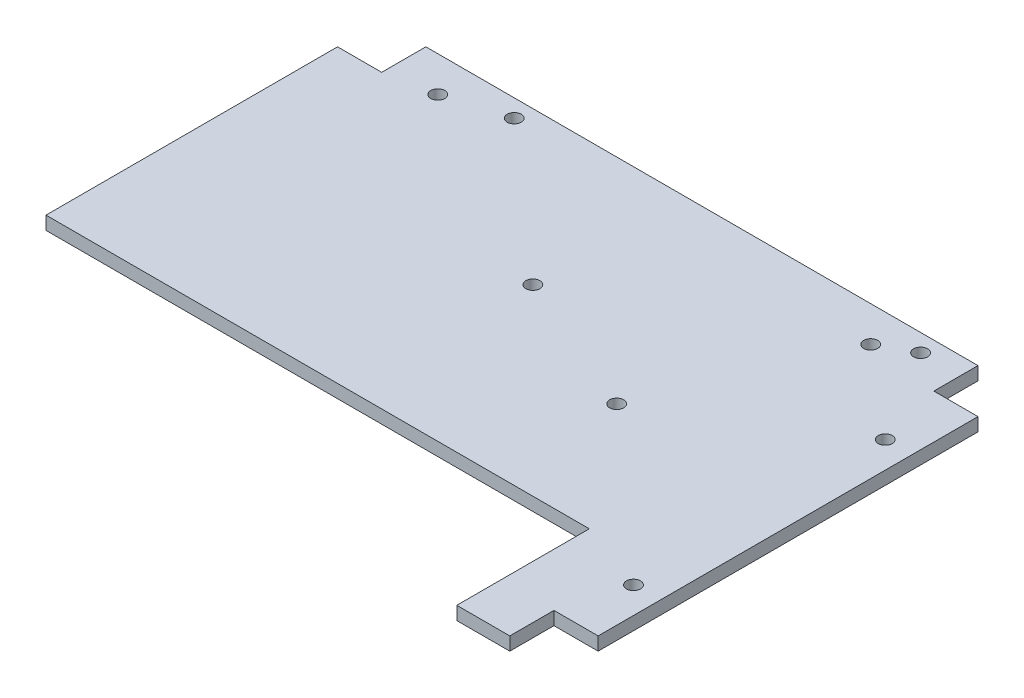
ISO-10303-21;
HEADER;
FILE_DESCRIPTION(('STEP AP214'),'2;1');
FILE_NAME('part.step','',(''),(''),'','','');
FILE_SCHEMA(('AUTOMOTIVE_DESIGN { 1 0 10303 214 1 1 1 1 }'));
ENDSEC;
DATA;
#1=APPLICATION_CONTEXT('core data for automotive mechanical design processes');
#2=APPLICATION_PROTOCOL_DEFINITION('international standard','automotive_design',2000,#1);
#3=PRODUCT_CONTEXT('',#1,'mechanical');
#4=PRODUCT('Part','Part','',(#3));
#5=PRODUCT_RELATED_PRODUCT_CATEGORY('part','',(#4));
#6=PRODUCT_DEFINITION_FORMATION('','',#4);
#7=PRODUCT_DEFINITION_CONTEXT('part definition',#1,'design');
#8=PRODUCT_DEFINITION('design','',#6,#7);
#9=PRODUCT_DEFINITION_SHAPE('','',#8);
#10=(LENGTH_UNIT() NAMED_UNIT(*) SI_UNIT(.MILLI.,.METRE.));
#11=(NAMED_UNIT(*) PLANE_ANGLE_UNIT() SI_UNIT($,.RADIAN.));
#12=(NAMED_UNIT(*) SI_UNIT($,.STERADIAN.) SOLID_ANGLE_UNIT());
#13=UNCERTAINTY_MEASURE_WITH_UNIT(LENGTH_MEASURE(1.E-05),#10,'distance_accuracy_value','');
#14=(GEOMETRIC_REPRESENTATION_CONTEXT(3) GLOBAL_UNCERTAINTY_ASSIGNED_CONTEXT((#13)) GLOBAL_UNIT_ASSIGNED_CONTEXT((#10,
#11,#12)) REPRESENTATION_CONTEXT('',''));
#15=CARTESIAN_POINT('',(0.,0.,0.));
#16=DIRECTION('',(0.,0.,1.));
#17=DIRECTION('',(1.,0.,0.));
#18=AXIS2_PLACEMENT_3D('',#15,#16,#17);
#19=CARTESIAN_POINT('',(0.,3.,96.));
#20=DIRECTION('',(-1.,0.,0.));
#21=DIRECTION('',(0.,0.,1.));
#22=AXIS2_PLACEMENT_3D('',#19,#20,#21);
#23=PLANE('',#22);
#24=DIRECTION('',(0.,0.,-1.));
#25=VECTOR('',#24,1.);
#26=CARTESIAN_POINT('',(0.,0.,96.));
#27=LINE('',#26,#25);
#28=CARTESIAN_POINT('',(0.,0.,96.));
#29=VERTEX_POINT('',#28);
#30=CARTESIAN_POINT('',(0.,0.,10.));
#31=VERTEX_POINT('',#30);
#32=EDGE_CURVE('E151',#29,#31,#27,.T.);
#33=ORIENTED_EDGE('',*,*,#32,.T.);
#34=DIRECTION('',(0.,-1.,0.));
#35=VECTOR('',#34,1.);
#36=CARTESIAN_POINT('',(0.,3.,10.));
#37=LINE('',#36,#35);
#38=CARTESIAN_POINT('',(0.,3.,10.));
#39=VERTEX_POINT('',#38);
#40=EDGE_CURVE('E11',#39,#31,#37,.T.);
#41=ORIENTED_EDGE('',*,*,#40,.F.);
#42=DIRECTION('',(0.,0.,-1.));
#43=VECTOR('',#42,1.);
#44=CARTESIAN_POINT('',(0.,3.,96.));
#45=LINE('',#44,#43);
#46=CARTESIAN_POINT('',(0.,3.,96.));
#47=VERTEX_POINT('',#46);
#48=EDGE_CURVE('E174',#47,#39,#45,.T.);
#49=ORIENTED_EDGE('',*,*,#48,.F.);
#50=DIRECTION('',(0.,-1.,0.));
#51=VECTOR('',#50,1.);
#52=CARTESIAN_POINT('',(0.,3.,96.));
#53=LINE('',#52,#51);
#54=EDGE_CURVE('E147',#47,#29,#53,.T.);
#55=ORIENTED_EDGE('',*,*,#54,.T.);
#56=EDGE_LOOP('',(#33,#41,#49,#55));
#57=FACE_BOUND('',#56,.T.);
#58=ADVANCED_FACE('F31',(#57),#23,.F.);
#59=CARTESIAN_POINT('',(-10.,3.,10.));
#60=DIRECTION('',(0.,0.,1.));
#61=DIRECTION('',(1.,0.,0.));
#62=AXIS2_PLACEMENT_3D('',#59,#60,#61);
#63=PLANE('',#62);
#64=DIRECTION('',(-1.,0.,0.));
#65=VECTOR('',#64,1.);
#66=CARTESIAN_POINT('',(-10.,0.,10.));
#67=LINE('',#66,#65);
#68=CARTESIAN_POINT('',(-10.,0.,10.));
#69=VERTEX_POINT('',#68);
#70=EDGE_CURVE('E154',#31,#69,#67,.T.);
#71=ORIENTED_EDGE('',*,*,#70,.T.);
#72=DIRECTION('',(0.,-1.,0.));
#73=VECTOR('',#72,1.);
#74=CARTESIAN_POINT('',(-10.,3.,10.));
#75=LINE('',#74,#73);
#76=CARTESIAN_POINT('',(-10.,3.,10.));
#77=VERTEX_POINT('',#76);
#78=EDGE_CURVE('E39',#77,#69,#75,.T.);
#79=ORIENTED_EDGE('',*,*,#78,.F.);
#80=DIRECTION('',(-1.,0.,0.));
#81=VECTOR('',#80,1.);
#82=CARTESIAN_POINT('',(-10.,3.,10.));
#83=LINE('',#82,#81);
#84=EDGE_CURVE('E102',#39,#77,#83,.T.);
#85=ORIENTED_EDGE('',*,*,#84,.F.);
#86=ORIENTED_EDGE('',*,*,#40,.T.);
#87=EDGE_LOOP('',(#71,#79,#85,#86));
#88=FACE_BOUND('',#87,.T.);
#89=ADVANCED_FACE('F253',(#88),#63,.F.);
#90=CARTESIAN_POINT('',(-10.,3.,0.));
#91=DIRECTION('',(-1.,0.,0.));
#92=DIRECTION('',(0.,0.,1.));
#93=AXIS2_PLACEMENT_3D('',#90,#91,#92);
#94=PLANE('',#93);
#95=DIRECTION('',(0.,0.,-1.));
#96=VECTOR('',#95,1.);
#97=CARTESIAN_POINT('',(-10.,0.,0.));
#98=LINE('',#97,#96);
#99=CARTESIAN_POINT('',(-10.,0.,0.));
#100=VERTEX_POINT('',#99);
#101=EDGE_CURVE('E157',#69,#100,#98,.T.);
#102=ORIENTED_EDGE('',*,*,#101,.T.);
#103=DIRECTION('',(0.,-1.,0.));
#104=VECTOR('',#103,1.);
#105=CARTESIAN_POINT('',(-10.,3.,0.));
#106=LINE('',#105,#104);
#107=CARTESIAN_POINT('',(-10.,3.,0.));
#108=VERTEX_POINT('',#107);
#109=EDGE_CURVE('E193',#108,#100,#106,.T.);
#110=ORIENTED_EDGE('',*,*,#109,.F.);
#111=DIRECTION('',(0.,0.,-1.));
#112=VECTOR('',#111,1.);
#113=CARTESIAN_POINT('',(-10.,3.,0.));
#114=LINE('',#113,#112);
#115=EDGE_CURVE('E201',#77,#108,#114,.T.);
#116=ORIENTED_EDGE('',*,*,#115,.F.);
#117=ORIENTED_EDGE('',*,*,#78,.T.);
#118=EDGE_LOOP('',(#102,#110,#116,#117));
#119=FACE_BOUND('',#118,.T.);
#120=ADVANCED_FACE('F199',(#119),#94,.F.);
#121=CARTESIAN_POINT('',(-135.,3.,0.));
#122=DIRECTION('',(0.,0.,1.));
#123=DIRECTION('',(1.,0.,0.));
#124=AXIS2_PLACEMENT_3D('',#121,#122,#123);
#125=PLANE('',#124);
#126=DIRECTION('',(-1.,0.,0.));
#127=VECTOR('',#126,1.);
#128=CARTESIAN_POINT('',(-135.,0.,0.));
#129=LINE('',#128,#127);
#130=CARTESIAN_POINT('',(-135.,0.,0.));
#131=VERTEX_POINT('',#130);
#132=EDGE_CURVE('E159',#100,#131,#129,.T.);
#133=ORIENTED_EDGE('',*,*,#132,.T.);
#134=DIRECTION('',(0.,-1.,0.));
#135=VECTOR('',#134,1.);
#136=CARTESIAN_POINT('',(-135.,3.,0.));
#137=LINE('',#136,#135);
#138=CARTESIAN_POINT('',(-135.,3.,0.));
#139=VERTEX_POINT('',#138);
#140=EDGE_CURVE('E190',#139,#131,#137,.T.);
#141=ORIENTED_EDGE('',*,*,#140,.F.);
#142=DIRECTION('',(-1.,0.,0.));
#143=VECTOR('',#142,1.);
#144=CARTESIAN_POINT('',(-135.,3.,0.));
#145=LINE('',#144,#143);
#146=EDGE_CURVE('E219',#108,#139,#145,.T.);
#147=ORIENTED_EDGE('',*,*,#146,.F.);
#148=ORIENTED_EDGE('',*,*,#109,.T.);
#149=EDGE_LOOP('',(#133,#141,#147,#148));
#150=FACE_BOUND('',#149,.T.);
#151=ADVANCED_FACE('F210',(#150),#125,.F.);
#152=CARTESIAN_POINT('',(-135.,3.,0.));
#153=DIRECTION('',(1.,0.,0.));
#154=DIRECTION('',(0.,0.,-1.));
#155=AXIS2_PLACEMENT_3D('',#152,#153,#154);
#156=PLANE('',#155);
#157=DIRECTION('',(0.,0.,1.));
#158=VECTOR('',#157,1.);
#159=CARTESIAN_POINT('',(-135.,0.,0.));
#160=LINE('',#159,#158);
#161=CARTESIAN_POINT('',(-135.,0.,10.));
#162=VERTEX_POINT('',#161);
#163=EDGE_CURVE('E161',#131,#162,#160,.T.);
#164=ORIENTED_EDGE('',*,*,#163,.T.);
#165=DIRECTION('',(0.,-1.,0.));
#166=VECTOR('',#165,1.);
#167=CARTESIAN_POINT('',(-135.,3.,10.));
#168=LINE('',#167,#166);
#169=CARTESIAN_POINT('',(-135.,3.,10.));
#170=VERTEX_POINT('',#169);
#171=EDGE_CURVE('E187',#170,#162,#168,.T.);
#172=ORIENTED_EDGE('',*,*,#171,.F.);
#173=DIRECTION('',(0.,0.,1.));
#174=VECTOR('',#173,1.);
#175=CARTESIAN_POINT('',(-135.,3.,0.));
#176=LINE('',#175,#174);
#177=EDGE_CURVE('E216',#139,#170,#176,.T.);
#178=ORIENTED_EDGE('',*,*,#177,.F.);
#179=ORIENTED_EDGE('',*,*,#140,.T.);
#180=EDGE_LOOP('',(#164,#172,#178,#179));
#181=FACE_BOUND('',#180,.T.);
#182=ADVANCED_FACE('F214',(#181),#156,.F.);
#183=CARTESIAN_POINT('',(-135.,3.,10.));
#184=DIRECTION('',(0.,0.,1.));
#185=DIRECTION('',(1.,0.,0.));
#186=AXIS2_PLACEMENT_3D('',#183,#184,#185);
#187=PLANE('',#186);
#188=DIRECTION('',(-1.,0.,0.));
#189=VECTOR('',#188,1.);
#190=CARTESIAN_POINT('',(-135.,0.,10.));
#191=LINE('',#190,#189);
#192=CARTESIAN_POINT('',(-145.,0.,10.));
#193=VERTEX_POINT('',#192);
#194=EDGE_CURVE('E163',#162,#193,#191,.T.);
#195=ORIENTED_EDGE('',*,*,#194,.T.);
#196=DIRECTION('',(0.,-1.,0.));
#197=VECTOR('',#196,1.);
#198=CARTESIAN_POINT('',(-145.,3.,10.));
#199=LINE('',#198,#197);
#200=CARTESIAN_POINT('',(-145.,3.,10.));
#201=VERTEX_POINT('',#200);
#202=EDGE_CURVE('E184',#201,#193,#199,.T.);
#203=ORIENTED_EDGE('',*,*,#202,.F.);
#204=DIRECTION('',(-1.,0.,0.));
#205=VECTOR('',#204,1.);
#206=CARTESIAN_POINT('',(-135.,3.,10.));
#207=LINE('',#206,#205);
#208=EDGE_CURVE('E218',#170,#201,#207,.T.);
#209=ORIENTED_EDGE('',*,*,#208,.F.);
#210=ORIENTED_EDGE('',*,*,#171,.T.);
#211=EDGE_LOOP('',(#195,#203,#209,#210));
#212=FACE_BOUND('',#211,.T.);
#213=ADVANCED_FACE('F266',(#212),#187,.F.);
#214=CARTESIAN_POINT('',(-145.,3.,10.));
#215=DIRECTION('',(1.,0.,0.));
#216=DIRECTION('',(0.,0.,-1.));
#217=AXIS2_PLACEMENT_3D('',#214,#215,#216);
#218=PLANE('',#217);
#219=DIRECTION('',(0.,0.,1.));
#220=VECTOR('',#219,1.);
#221=CARTESIAN_POINT('',(-145.,0.,10.));
#222=LINE('',#221,#220);
#223=CARTESIAN_POINT('',(-145.,0.,76.));
#224=VERTEX_POINT('',#223);
#225=EDGE_CURVE('E165',#193,#224,#222,.T.);
#226=ORIENTED_EDGE('',*,*,#225,.T.);
#227=DIRECTION('',(0.,-1.,0.));
#228=VECTOR('',#227,1.);
#229=CARTESIAN_POINT('',(-145.,3.,76.));
#230=LINE('',#229,#228);
#231=CARTESIAN_POINT('',(-145.,3.,76.));
#232=VERTEX_POINT('',#231);
#233=EDGE_CURVE('E181',#232,#224,#230,.T.);
#234=ORIENTED_EDGE('',*,*,#233,.F.);
#235=DIRECTION('',(0.,0.,1.));
#236=VECTOR('',#235,1.);
#237=CARTESIAN_POINT('',(-145.,3.,10.));
#238=LINE('',#237,#236);
#239=EDGE_CURVE('E221',#201,#232,#238,.T.);
#240=ORIENTED_EDGE('',*,*,#239,.F.);
#241=ORIENTED_EDGE('',*,*,#202,.T.);
#242=EDGE_LOOP('',(#226,#234,#240,#241));
#243=FACE_BOUND('',#242,.T.);
#244=ADVANCED_FACE('F269',(#243),#218,.F.);
#245=CARTESIAN_POINT('',(-145.,3.,76.));
#246=DIRECTION('',(0.,0.,-1.));
#247=DIRECTION('',(-1.,0.,0.));
#248=AXIS2_PLACEMENT_3D('',#245,#246,#247);
#249=PLANE('',#248);
#250=DIRECTION('',(1.,0.,0.));
#251=VECTOR('',#250,1.);
#252=CARTESIAN_POINT('',(-145.,0.,76.));
#253=LINE('',#252,#251);
#254=CARTESIAN_POINT('',(-22.,0.,76.));
#255=VERTEX_POINT('',#254);
#256=EDGE_CURVE('E167',#224,#255,#253,.T.);
#257=ORIENTED_EDGE('',*,*,#256,.T.);
#258=DIRECTION('',(0.,-1.,0.));
#259=VECTOR('',#258,1.);
#260=CARTESIAN_POINT('',(-22.,3.,76.));
#261=LINE('',#260,#259);
#262=CARTESIAN_POINT('',(-22.,3.,76.));
#263=VERTEX_POINT('',#262);
#264=EDGE_CURVE('E178',#263,#255,#261,.T.);
#265=ORIENTED_EDGE('',*,*,#264,.F.);
#266=DIRECTION('',(1.,0.,0.));
#267=VECTOR('',#266,1.);
#268=CARTESIAN_POINT('',(-145.,3.,76.));
#269=LINE('',#268,#267);
#270=EDGE_CURVE('E227',#232,#263,#269,.T.);
#271=ORIENTED_EDGE('',*,*,#270,.F.);
#272=ORIENTED_EDGE('',*,*,#233,.T.);
#273=EDGE_LOOP('',(#257,#265,#271,#272));
#274=FACE_BOUND('',#273,.T.);
#275=ADVANCED_FACE('F233',(#274),#249,.F.);
#276=CARTESIAN_POINT('',(-22.,3.,76.));
#277=DIRECTION('',(1.,0.,0.));
#278=DIRECTION('',(0.,0.,-1.));
#279=AXIS2_PLACEMENT_3D('',#276,#277,#278);
#280=PLANE('',#279);
#281=DIRECTION('',(0.,0.,1.));
#282=VECTOR('',#281,1.);
#283=CARTESIAN_POINT('',(-22.,0.,76.));
#284=LINE('',#283,#282);
#285=CARTESIAN_POINT('',(-22.,0.,106.));
#286=VERTEX_POINT('',#285);
#287=EDGE_CURVE('E169',#255,#286,#284,.T.);
#288=ORIENTED_EDGE('',*,*,#287,.T.);
#289=DIRECTION('',(0.,-1.,0.));
#290=VECTOR('',#289,1.);
#291=CARTESIAN_POINT('',(-22.,3.,106.));
#292=LINE('',#291,#290);
#293=CARTESIAN_POINT('',(-22.,3.,106.));
#294=VERTEX_POINT('',#293);
#295=EDGE_CURVE('E142',#294,#286,#292,.T.);
#296=ORIENTED_EDGE('',*,*,#295,.F.);
#297=DIRECTION('',(0.,0.,1.));
#298=VECTOR('',#297,1.);
#299=CARTESIAN_POINT('',(-22.,3.,76.));
#300=LINE('',#299,#298);
#301=EDGE_CURVE('E133',#263,#294,#300,.T.);
#302=ORIENTED_EDGE('',*,*,#301,.F.);
#303=ORIENTED_EDGE('',*,*,#264,.T.);
#304=EDGE_LOOP('',(#288,#296,#302,#303));
#305=FACE_BOUND('',#304,.T.);
#306=ADVANCED_FACE('F237',(#305),#280,.F.);
#307=CARTESIAN_POINT('',(-22.,3.,106.));
#308=DIRECTION('',(0.,0.,-1.));
#309=DIRECTION('',(-1.,0.,0.));
#310=AXIS2_PLACEMENT_3D('',#307,#308,#309);
#311=PLANE('',#310);
#312=DIRECTION('',(1.,0.,0.));
#313=VECTOR('',#312,1.);
#314=CARTESIAN_POINT('',(-22.,0.,106.));
#315=LINE('',#314,#313);
#316=CARTESIAN_POINT('',(-10.,0.,106.));
#317=VERTEX_POINT('',#316);
#318=EDGE_CURVE('E141',#286,#317,#315,.T.);
#319=ORIENTED_EDGE('',*,*,#318,.T.);
#320=DIRECTION('',(0.,-1.,0.));
#321=VECTOR('',#320,1.);
#322=CARTESIAN_POINT('',(-10.,3.,106.));
#323=LINE('',#322,#321);
#324=CARTESIAN_POINT('',(-10.,3.,106.));
#325=VERTEX_POINT('',#324);
#326=EDGE_CURVE('E138',#325,#317,#323,.T.);
#327=ORIENTED_EDGE('',*,*,#326,.F.);
#328=DIRECTION('',(1.,0.,0.));
#329=VECTOR('',#328,1.);
#330=CARTESIAN_POINT('',(-22.,3.,106.));
#331=LINE('',#330,#329);
#332=EDGE_CURVE('E127',#294,#325,#331,.T.);
#333=ORIENTED_EDGE('',*,*,#332,.F.);
#334=ORIENTED_EDGE('',*,*,#295,.T.);
#335=EDGE_LOOP('',(#319,#327,#333,#334));
#336=FACE_BOUND('',#335,.T.);
#337=ADVANCED_FACE('F139',(#336),#311,.F.);
#338=CARTESIAN_POINT('',(-10.,3.,106.));
#339=DIRECTION('',(-1.,0.,0.));
#340=DIRECTION('',(0.,0.,1.));
#341=AXIS2_PLACEMENT_3D('',#338,#339,#340);
#342=PLANE('',#341);
#343=DIRECTION('',(0.,0.,-1.));
#344=VECTOR('',#343,1.);
#345=CARTESIAN_POINT('',(-10.,0.,106.));
#346=LINE('',#345,#344);
#347=CARTESIAN_POINT('',(-10.,0.,96.));
#348=VERTEX_POINT('',#347);
#349=EDGE_CURVE('E88',#317,#348,#346,.T.);
#350=ORIENTED_EDGE('',*,*,#349,.T.);
#351=DIRECTION('',(0.,-1.,0.));
#352=VECTOR('',#351,1.);
#353=CARTESIAN_POINT('',(-10.,3.,96.));
#354=LINE('',#353,#352);
#355=CARTESIAN_POINT('',(-10.,3.,96.));
#356=VERTEX_POINT('',#355);
#357=EDGE_CURVE('E143',#356,#348,#354,.T.);
#358=ORIENTED_EDGE('',*,*,#357,.F.);
#359=DIRECTION('',(0.,0.,-1.));
#360=VECTOR('',#359,1.);
#361=CARTESIAN_POINT('',(-10.,3.,106.));
#362=LINE('',#361,#360);
#363=EDGE_CURVE('E131',#325,#356,#362,.T.);
#364=ORIENTED_EDGE('',*,*,#363,.F.);
#365=ORIENTED_EDGE('',*,*,#326,.T.);
#366=EDGE_LOOP('',(#350,#358,#364,#365));
#367=FACE_BOUND('',#366,.T.);
#368=ADVANCED_FACE('F145',(#367),#342,.F.);
#369=CARTESIAN_POINT('',(-10.,3.,96.));
#370=DIRECTION('',(0.,0.,-1.));
#371=DIRECTION('',(-1.,0.,0.));
#372=AXIS2_PLACEMENT_3D('',#369,#370,#371);
#373=PLANE('',#372);
#374=DIRECTION('',(1.,0.,0.));
#375=VECTOR('',#374,1.);
#376=CARTESIAN_POINT('',(-10.,0.,96.));
#377=LINE('',#376,#375);
#378=EDGE_CURVE('E94',#348,#29,#377,.T.);
#379=ORIENTED_EDGE('',*,*,#378,.T.);
#380=ORIENTED_EDGE('',*,*,#54,.F.);
#381=DIRECTION('',(1.,0.,0.));
#382=VECTOR('',#381,1.);
#383=CARTESIAN_POINT('',(-10.,3.,96.));
#384=LINE('',#383,#382);
#385=EDGE_CURVE('E47',#356,#47,#384,.T.);
#386=ORIENTED_EDGE('',*,*,#385,.F.);
#387=ORIENTED_EDGE('',*,*,#357,.T.);
#388=EDGE_LOOP('',(#379,#380,#386,#387));
#389=FACE_BOUND('',#388,.T.);
#390=ADVANCED_FACE('F241',(#389),#373,.F.);
#391=CARTESIAN_POINT('',(0.,3.,10.));
#392=DIRECTION('',(0.,-1.,0.));
#393=DIRECTION('',(0.,0.,-1.));
#394=AXIS2_PLACEMENT_3D('',#391,#392,#393);
#395=PLANE('',#394);
#396=CARTESIAN_POINT('',(-76.25,3.,34.5240251999919));
#397=DIRECTION('',(0.,1.,0.));
#398=DIRECTION('',(0.,0.,1.));
#399=AXIS2_PLACEMENT_3D('',#396,#397,#398);
#400=CIRCLE('',#399,1.5875);
#401=CARTESIAN_POINT('',(-76.25,3.,36.1115251999919));
#402=VERTEX_POINT('',#401);
#403=EDGE_CURVE('E392',#402,#402,#400,.T.);
#404=ORIENTED_EDGE('',*,*,#403,.F.);
#405=EDGE_LOOP('',(#404));
#406=FACE_BOUND('',#405,.T.);
#407=CARTESIAN_POINT('',(-43.4,3.,48.4));
#408=DIRECTION('',(0.,1.,0.));
#409=DIRECTION('',(0.,0.,1.));
#410=AXIS2_PLACEMENT_3D('',#407,#408,#409);
#411=CIRCLE('',#410,1.5875);
#412=CARTESIAN_POINT('',(-43.4,3.,49.9875));
#413=VERTEX_POINT('',#412);
#414=EDGE_CURVE('E396',#413,#413,#411,.T.);
#415=ORIENTED_EDGE('',*,*,#414,.F.);
#416=EDGE_LOOP('',(#415));
#417=FACE_BOUND('',#416,.T.);
#418=CARTESIAN_POINT('',(-19.,3.,4.));
#419=DIRECTION('',(0.,1.,0.));
#420=DIRECTION('',(0.,0.,1.));
#421=AXIS2_PLACEMENT_3D('',#418,#419,#420);
#422=CIRCLE('',#421,1.5875);
#423=CARTESIAN_POINT('',(-19.,3.,5.5875));
#424=VERTEX_POINT('',#423);
#425=EDGE_CURVE('E405',#424,#424,#422,.T.);
#426=ORIENTED_EDGE('',*,*,#425,.F.);
#427=EDGE_LOOP('',(#426));
#428=FACE_BOUND('',#427,.T.);
#429=CARTESIAN_POINT('',(-111.,3.,4.));
#430=DIRECTION('',(0.,1.,0.));
#431=DIRECTION('',(0.,0.,1.));
#432=AXIS2_PLACEMENT_3D('',#429,#430,#431);
#433=CIRCLE('',#432,1.5875);
#434=CARTESIAN_POINT('',(-111.,3.,5.5875));
#435=VERTEX_POINT('',#434);
#436=EDGE_CURVE('E411',#435,#435,#433,.T.);
#437=ORIENTED_EDGE('',*,*,#436,.F.);
#438=EDGE_LOOP('',(#437));
#439=FACE_BOUND('',#438,.T.);
#440=CARTESIAN_POINT('',(-124.3,3.,8.));
#441=DIRECTION('',(0.,1.,0.));
#442=DIRECTION('',(0.,0.,1.));
#443=AXIS2_PLACEMENT_3D('',#440,#441,#442);
#444=CIRCLE('',#443,1.5875);
#445=CARTESIAN_POINT('',(-124.3,3.,9.5875));
#446=VERTEX_POINT('',#445);
#447=EDGE_CURVE('E417',#446,#446,#444,.T.);
#448=ORIENTED_EDGE('',*,*,#447,.F.);
#449=EDGE_LOOP('',(#448));
#450=FACE_BOUND('',#449,.T.);
#451=CARTESIAN_POINT('',(-26.3,3.,8.));
#452=DIRECTION('',(0.,1.,0.));
#453=DIRECTION('',(0.,0.,1.));
#454=AXIS2_PLACEMENT_3D('',#451,#452,#453);
#455=CIRCLE('',#454,1.5875);
#456=CARTESIAN_POINT('',(-26.3,3.,9.5875));
#457=VERTEX_POINT('',#456);
#458=EDGE_CURVE('E423',#457,#457,#455,.T.);
#459=ORIENTED_EDGE('',*,*,#458,.F.);
#460=EDGE_LOOP('',(#459));
#461=FACE_BOUND('',#460,.T.);
#462=CARTESIAN_POINT('',(-6.,3.,82.));
#463=DIRECTION('',(0.,1.,0.));
#464=DIRECTION('',(0.,0.,1.));
#465=AXIS2_PLACEMENT_3D('',#462,#463,#464);
#466=CIRCLE('',#465,1.5875);
#467=CARTESIAN_POINT('',(-6.,3.,83.5875));
#468=VERTEX_POINT('',#467);
#469=EDGE_CURVE('E429',#468,#468,#466,.T.);
#470=ORIENTED_EDGE('',*,*,#469,.F.);
#471=EDGE_LOOP('',(#470));
#472=FACE_BOUND('',#471,.T.);
#473=CARTESIAN_POINT('',(-6.,3.,25.));
#474=DIRECTION('',(0.,1.,0.));
#475=DIRECTION('',(0.,0.,1.));
#476=AXIS2_PLACEMENT_3D('',#473,#474,#475);
#477=CIRCLE('',#476,1.5875);
#478=CARTESIAN_POINT('',(-6.,3.,26.5875));
#479=VERTEX_POINT('',#478);
#480=EDGE_CURVE('E435',#479,#479,#477,.T.);
#481=ORIENTED_EDGE('',*,*,#480,.F.);
#482=EDGE_LOOP('',(#481));
#483=FACE_BOUND('',#482,.T.);
#484=ORIENTED_EDGE('',*,*,#48,.T.);
#485=ORIENTED_EDGE('',*,*,#84,.T.);
#486=ORIENTED_EDGE('',*,*,#115,.T.);
#487=ORIENTED_EDGE('',*,*,#146,.T.);
#488=ORIENTED_EDGE('',*,*,#177,.T.);
#489=ORIENTED_EDGE('',*,*,#208,.T.);
#490=ORIENTED_EDGE('',*,*,#239,.T.);
#491=ORIENTED_EDGE('',*,*,#270,.T.);
#492=ORIENTED_EDGE('',*,*,#301,.T.);
#493=ORIENTED_EDGE('',*,*,#332,.T.);
#494=ORIENTED_EDGE('',*,*,#363,.T.);
#495=ORIENTED_EDGE('',*,*,#385,.T.);
#496=EDGE_LOOP('',(#484,#485,#486,#487,#488,#489,#490,#491,#492,#493,#494,#495));
#497=FACE_BOUND('',#496,.T.);
#498=ADVANCED_FACE('F129',(#406,#417,#428,#439,#450,#461,#472,#483,#497),#395,.F.);
#499=CARTESIAN_POINT('',(0.,0.,10.));
#500=DIRECTION('',(0.,-1.,0.));
#501=DIRECTION('',(0.,0.,-1.));
#502=AXIS2_PLACEMENT_3D('',#499,#500,#501);
#503=PLANE('',#502);
#504=CARTESIAN_POINT('',(-76.25,0.,34.5240251999919));
#505=DIRECTION('',(0.,-1.,0.));
#506=DIRECTION('',(0.,0.,-1.));
#507=AXIS2_PLACEMENT_3D('',#504,#505,#506);
#508=CIRCLE('',#507,1.5875);
#509=CARTESIAN_POINT('',(-76.25,0.,32.9365251999919));
#510=VERTEX_POINT('',#509);
#511=EDGE_CURVE('E395',#510,#510,#508,.F.);
#512=ORIENTED_EDGE('',*,*,#511,.T.);
#513=EDGE_LOOP('',(#512));
#514=FACE_BOUND('',#513,.T.);
#515=CARTESIAN_POINT('',(-43.4,0.,48.4));
#516=DIRECTION('',(0.,-1.,0.));
#517=DIRECTION('',(0.,0.,-1.));
#518=AXIS2_PLACEMENT_3D('',#515,#516,#517);
#519=CIRCLE('',#518,1.5875);
#520=CARTESIAN_POINT('',(-43.4,0.,46.8125));
#521=VERTEX_POINT('',#520);
#522=EDGE_CURVE('E399',#521,#521,#519,.F.);
#523=ORIENTED_EDGE('',*,*,#522,.T.);
#524=EDGE_LOOP('',(#523));
#525=FACE_BOUND('',#524,.T.);
#526=CARTESIAN_POINT('',(-19.,0.,4.));
#527=DIRECTION('',(0.,-1.,0.));
#528=DIRECTION('',(0.,0.,-1.));
#529=AXIS2_PLACEMENT_3D('',#526,#527,#528);
#530=CIRCLE('',#529,1.5875);
#531=CARTESIAN_POINT('',(-19.,0.,2.4125));
#532=VERTEX_POINT('',#531);
#533=EDGE_CURVE('E408',#532,#532,#530,.F.);
#534=ORIENTED_EDGE('',*,*,#533,.T.);
#535=EDGE_LOOP('',(#534));
#536=FACE_BOUND('',#535,.T.);
#537=CARTESIAN_POINT('',(-111.,0.,4.));
#538=DIRECTION('',(0.,-1.,0.));
#539=DIRECTION('',(0.,0.,-1.));
#540=AXIS2_PLACEMENT_3D('',#537,#538,#539);
#541=CIRCLE('',#540,1.5875);
#542=CARTESIAN_POINT('',(-111.,0.,2.4125));
#543=VERTEX_POINT('',#542);
#544=EDGE_CURVE('E414',#543,#543,#541,.F.);
#545=ORIENTED_EDGE('',*,*,#544,.T.);
#546=EDGE_LOOP('',(#545));
#547=FACE_BOUND('',#546,.T.);
#548=CARTESIAN_POINT('',(-124.3,0.,8.));
#549=DIRECTION('',(0.,-1.,0.));
#550=DIRECTION('',(0.,0.,-1.));
#551=AXIS2_PLACEMENT_3D('',#548,#549,#550);
#552=CIRCLE('',#551,1.5875);
#553=CARTESIAN_POINT('',(-124.3,0.,6.4125));
#554=VERTEX_POINT('',#553);
#555=EDGE_CURVE('E420',#554,#554,#552,.F.);
#556=ORIENTED_EDGE('',*,*,#555,.T.);
#557=EDGE_LOOP('',(#556));
#558=FACE_BOUND('',#557,.T.);
#559=CARTESIAN_POINT('',(-26.3,0.,8.));
#560=DIRECTION('',(0.,-1.,0.));
#561=DIRECTION('',(0.,0.,-1.));
#562=AXIS2_PLACEMENT_3D('',#559,#560,#561);
#563=CIRCLE('',#562,1.5875);
#564=CARTESIAN_POINT('',(-26.3,0.,6.4125));
#565=VERTEX_POINT('',#564);
#566=EDGE_CURVE('E426',#565,#565,#563,.F.);
#567=ORIENTED_EDGE('',*,*,#566,.T.);
#568=EDGE_LOOP('',(#567));
#569=FACE_BOUND('',#568,.T.);
#570=CARTESIAN_POINT('',(-6.,0.,82.));
#571=DIRECTION('',(0.,-1.,0.));
#572=DIRECTION('',(0.,0.,-1.));
#573=AXIS2_PLACEMENT_3D('',#570,#571,#572);
#574=CIRCLE('',#573,1.5875);
#575=CARTESIAN_POINT('',(-6.,0.,80.4125));
#576=VERTEX_POINT('',#575);
#577=EDGE_CURVE('E432',#576,#576,#574,.F.);
#578=ORIENTED_EDGE('',*,*,#577,.T.);
#579=EDGE_LOOP('',(#578));
#580=FACE_BOUND('',#579,.T.);
#581=CARTESIAN_POINT('',(-6.,0.,25.));
#582=DIRECTION('',(0.,-1.,0.));
#583=DIRECTION('',(0.,0.,-1.));
#584=AXIS2_PLACEMENT_3D('',#581,#582,#583);
#585=CIRCLE('',#584,1.5875);
#586=CARTESIAN_POINT('',(-6.,0.,23.4125));
#587=VERTEX_POINT('',#586);
#588=EDGE_CURVE('E155',#587,#587,#585,.F.);
#589=ORIENTED_EDGE('',*,*,#588,.T.);
#590=EDGE_LOOP('',(#589));
#591=FACE_BOUND('',#590,.T.);
#592=ORIENTED_EDGE('',*,*,#32,.F.);
#593=ORIENTED_EDGE('',*,*,#378,.F.);
#594=ORIENTED_EDGE('',*,*,#349,.F.);
#595=ORIENTED_EDGE('',*,*,#318,.F.);
#596=ORIENTED_EDGE('',*,*,#287,.F.);
#597=ORIENTED_EDGE('',*,*,#256,.F.);
#598=ORIENTED_EDGE('',*,*,#225,.F.);
#599=ORIENTED_EDGE('',*,*,#194,.F.);
#600=ORIENTED_EDGE('',*,*,#163,.F.);
#601=ORIENTED_EDGE('',*,*,#132,.F.);
#602=ORIENTED_EDGE('',*,*,#101,.F.);
#603=ORIENTED_EDGE('',*,*,#70,.F.);
#604=EDGE_LOOP('',(#592,#593,#594,#595,#596,#597,#598,#599,#600,#601,#602,#603));
#605=FACE_BOUND('',#604,.T.);
#606=ADVANCED_FACE('F205',(#514,#525,#536,#547,#558,#569,#580,#591,#605),#503,.T.);
#607=CARTESIAN_POINT('',(-6.,-4.49012806053458,25.));
#608=DIRECTION('',(0.,1.,0.));
#609=DIRECTION('',(0.,0.,1.));
#610=AXIS2_PLACEMENT_3D('',#607,#608,#609);
#611=CYLINDRICAL_SURFACE('',#610,1.5875);
#612=ORIENTED_EDGE('',*,*,#480,.T.);
#613=EDGE_LOOP('',(#612));
#614=FACE_BOUND('',#613,.T.);
#615=ORIENTED_EDGE('',*,*,#588,.F.);
#616=EDGE_LOOP('',(#615));
#617=FACE_BOUND('',#616,.T.);
#618=ADVANCED_FACE('F297',(#614,#617),#611,.F.);
#619=CARTESIAN_POINT('',(-6.,-4.49012806053458,82.));
#620=DIRECTION('',(0.,1.,0.));
#621=DIRECTION('',(0.,0.,1.));
#622=AXIS2_PLACEMENT_3D('',#619,#620,#621);
#623=CYLINDRICAL_SURFACE('',#622,1.5875);
#624=ORIENTED_EDGE('',*,*,#469,.T.);
#625=EDGE_LOOP('',(#624));
#626=FACE_BOUND('',#625,.T.);
#627=ORIENTED_EDGE('',*,*,#577,.F.);
#628=EDGE_LOOP('',(#627));
#629=FACE_BOUND('',#628,.T.);
#630=ADVANCED_FACE('F302',(#626,#629),#623,.F.);
#631=CARTESIAN_POINT('',(-26.3,-4.49012806053458,8.));
#632=DIRECTION('',(0.,1.,0.));
#633=DIRECTION('',(0.,0.,1.));
#634=AXIS2_PLACEMENT_3D('',#631,#632,#633);
#635=CYLINDRICAL_SURFACE('',#634,1.5875);
#636=ORIENTED_EDGE('',*,*,#458,.T.);
#637=EDGE_LOOP('',(#636));
#638=FACE_BOUND('',#637,.T.);
#639=ORIENTED_EDGE('',*,*,#566,.F.);
#640=EDGE_LOOP('',(#639));
#641=FACE_BOUND('',#640,.T.);
#642=ADVANCED_FACE('F314',(#638,#641),#635,.F.);
#643=CARTESIAN_POINT('',(-124.3,-4.49012806053458,8.));
#644=DIRECTION('',(0.,1.,0.));
#645=DIRECTION('',(0.,0.,1.));
#646=AXIS2_PLACEMENT_3D('',#643,#644,#645);
#647=CYLINDRICAL_SURFACE('',#646,1.5875);
#648=ORIENTED_EDGE('',*,*,#447,.T.);
#649=EDGE_LOOP('',(#648));
#650=FACE_BOUND('',#649,.T.);
#651=ORIENTED_EDGE('',*,*,#555,.F.);
#652=EDGE_LOOP('',(#651));
#653=FACE_BOUND('',#652,.T.);
#654=ADVANCED_FACE('F324',(#650,#653),#647,.F.);
#655=CARTESIAN_POINT('',(-111.,-4.49012806053458,4.));
#656=DIRECTION('',(0.,1.,0.));
#657=DIRECTION('',(0.,0.,1.));
#658=AXIS2_PLACEMENT_3D('',#655,#656,#657);
#659=CYLINDRICAL_SURFACE('',#658,1.5875);
#660=ORIENTED_EDGE('',*,*,#436,.T.);
#661=EDGE_LOOP('',(#660));
#662=FACE_BOUND('',#661,.T.);
#663=ORIENTED_EDGE('',*,*,#544,.F.);
#664=EDGE_LOOP('',(#663));
#665=FACE_BOUND('',#664,.T.);
#666=ADVANCED_FACE('F334',(#662,#665),#659,.F.);
#667=CARTESIAN_POINT('',(-19.,-4.49012806053458,4.));
#668=DIRECTION('',(0.,1.,0.));
#669=DIRECTION('',(0.,0.,1.));
#670=AXIS2_PLACEMENT_3D('',#667,#668,#669);
#671=CYLINDRICAL_SURFACE('',#670,1.5875);
#672=ORIENTED_EDGE('',*,*,#425,.T.);
#673=EDGE_LOOP('',(#672));
#674=FACE_BOUND('',#673,.T.);
#675=ORIENTED_EDGE('',*,*,#533,.F.);
#676=EDGE_LOOP('',(#675));
#677=FACE_BOUND('',#676,.T.);
#678=ADVANCED_FACE('F344',(#674,#677),#671,.F.);
#679=CARTESIAN_POINT('',(-43.4,-4.49012806053458,48.4));
#680=DIRECTION('',(0.,1.,0.));
#681=DIRECTION('',(0.,0.,1.));
#682=AXIS2_PLACEMENT_3D('',#679,#680,#681);
#683=CYLINDRICAL_SURFACE('',#682,1.5875);
#684=ORIENTED_EDGE('',*,*,#414,.T.);
#685=EDGE_LOOP('',(#684));
#686=FACE_BOUND('',#685,.T.);
#687=ORIENTED_EDGE('',*,*,#522,.F.);
#688=EDGE_LOOP('',(#687));
#689=FACE_BOUND('',#688,.T.);
#690=ADVANCED_FACE('F354',(#686,#689),#683,.F.);
#691=CARTESIAN_POINT('',(-76.25,-4.49012806053458,34.5240251999919));
#692=DIRECTION('',(0.,1.,0.));
#693=DIRECTION('',(0.,0.,1.));
#694=AXIS2_PLACEMENT_3D('',#691,#692,#693);
#695=CYLINDRICAL_SURFACE('',#694,1.5875);
#696=ORIENTED_EDGE('',*,*,#403,.T.);
#697=EDGE_LOOP('',(#696));
#698=FACE_BOUND('',#697,.T.);
#699=ORIENTED_EDGE('',*,*,#511,.F.);
#700=EDGE_LOOP('',(#699));
#701=FACE_BOUND('',#700,.T.);
#702=ADVANCED_FACE('F364',(#698,#701),#695,.F.);
#703=CLOSED_SHELL('',(#58,#89,#120,#151,#182,#213,#244,#275,#306,#337,#368,#390,#498,#606,#618,
#630,#642,#654,#666,#678,#690,#702));
#704=MANIFOLD_SOLID_BREP('B2',#703);
#705=ADVANCED_BREP_SHAPE_REPRESENTATION('',(#18,#704),#14);
#706=SHAPE_DEFINITION_REPRESENTATION(#9,#705);
ENDSEC;
END-ISO-10303-21;
